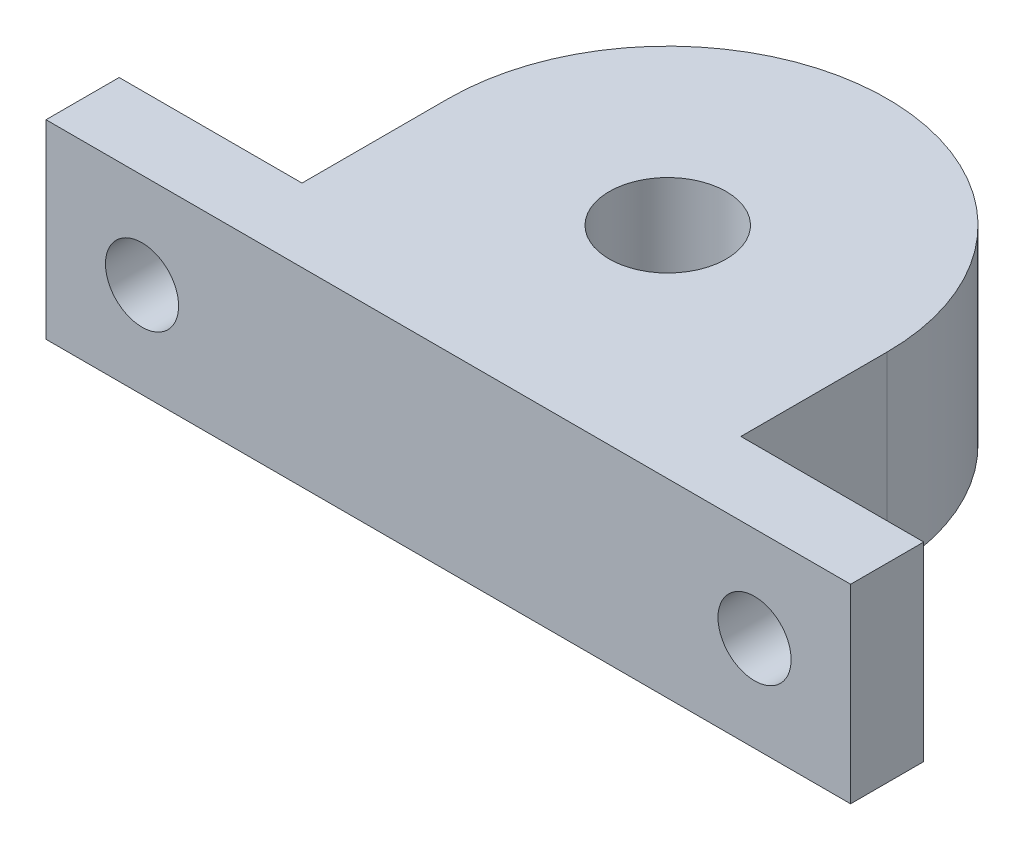
ISO-10303-21;
HEADER;
FILE_DESCRIPTION(('STEP AP214'),'2;1');
FILE_NAME('part.step','',(''),(''),'','','');
FILE_SCHEMA(('AUTOMOTIVE_DESIGN { 1 0 10303 214 1 1 1 1 }'));
ENDSEC;
DATA;
#1=APPLICATION_CONTEXT('core data for automotive mechanical design processes');
#2=APPLICATION_PROTOCOL_DEFINITION('international standard','automotive_design',2000,#1);
#3=PRODUCT_CONTEXT('',#1,'mechanical');
#4=PRODUCT('Part','Part','',(#3));
#5=PRODUCT_RELATED_PRODUCT_CATEGORY('part','',(#4));
#6=PRODUCT_DEFINITION_FORMATION('','',#4);
#7=PRODUCT_DEFINITION_CONTEXT('part definition',#1,'design');
#8=PRODUCT_DEFINITION('design','',#6,#7);
#9=PRODUCT_DEFINITION_SHAPE('','',#8);
#10=(LENGTH_UNIT() NAMED_UNIT(*) SI_UNIT(.MILLI.,.METRE.));
#11=(NAMED_UNIT(*) PLANE_ANGLE_UNIT() SI_UNIT($,.RADIAN.));
#12=(NAMED_UNIT(*) SI_UNIT($,.STERADIAN.) SOLID_ANGLE_UNIT());
#13=UNCERTAINTY_MEASURE_WITH_UNIT(LENGTH_MEASURE(1.E-05),#10,'distance_accuracy_value','');
#14=(GEOMETRIC_REPRESENTATION_CONTEXT(3) GLOBAL_UNCERTAINTY_ASSIGNED_CONTEXT((#13)) GLOBAL_UNIT_ASSIGNED_CONTEXT((#10,
#11,#12)) REPRESENTATION_CONTEXT('',''));
#15=CARTESIAN_POINT('',(0.,0.,0.));
#16=DIRECTION('',(0.,0.,1.));
#17=DIRECTION('',(1.,0.,0.));
#18=AXIS2_PLACEMENT_3D('',#15,#16,#17);
#19=CARTESIAN_POINT('',(0.,13.,0.));
#20=DIRECTION('',(0.,1.,0.));
#21=DIRECTION('',(0.,0.,1.));
#22=AXIS2_PLACEMENT_3D('',#19,#20,#21);
#23=PLANE('',#22);
#24=CARTESIAN_POINT('',(0.,13.,0.));
#25=DIRECTION('',(0.,1.,0.));
#26=DIRECTION('',(0.,0.,1.));
#27=AXIS2_PLACEMENT_3D('',#24,#25,#26);
#28=CIRCLE('',#27,15.);
#29=CARTESIAN_POINT('',(15.,13.,0.));
#30=VERTEX_POINT('',#29);
#31=CARTESIAN_POINT('',(-15.,13.,0.));
#32=VERTEX_POINT('',#31);
#33=EDGE_CURVE('E148',#30,#32,#28,.T.);
#34=ORIENTED_EDGE('',*,*,#33,.T.);
#35=DIRECTION('',(0.,0.,1.));
#36=VECTOR('',#35,1.);
#37=CARTESIAN_POINT('',(-15.,13.,0.));
#38=LINE('',#37,#36);
#39=CARTESIAN_POINT('',(-15.,13.,10.));
#40=VERTEX_POINT('',#39);
#41=EDGE_CURVE('E96',#32,#40,#38,.T.);
#42=ORIENTED_EDGE('',*,*,#41,.T.);
#43=DIRECTION('',(-1.,0.,0.));
#44=VECTOR('',#43,1.);
#45=CARTESIAN_POINT('',(-15.,13.,10.));
#46=LINE('',#45,#44);
#47=CARTESIAN_POINT('',(-27.5,13.,10.));
#48=VERTEX_POINT('',#47);
#49=EDGE_CURVE('E163',#40,#48,#46,.T.);
#50=ORIENTED_EDGE('',*,*,#49,.T.);
#51=DIRECTION('',(0.,0.,1.));
#52=VECTOR('',#51,1.);
#53=CARTESIAN_POINT('',(-27.5,13.,10.));
#54=LINE('',#53,#52);
#55=CARTESIAN_POINT('',(-27.5,13.,15.));
#56=VERTEX_POINT('',#55);
#57=EDGE_CURVE('E176',#48,#56,#54,.T.);
#58=ORIENTED_EDGE('',*,*,#57,.T.);
#59=DIRECTION('',(1.,0.,0.));
#60=VECTOR('',#59,1.);
#61=CARTESIAN_POINT('',(-27.5,13.,15.));
#62=LINE('',#61,#60);
#63=CARTESIAN_POINT('',(27.5,13.,15.));
#64=VERTEX_POINT('',#63);
#65=EDGE_CURVE('E115',#56,#64,#62,.T.);
#66=ORIENTED_EDGE('',*,*,#65,.T.);
#67=DIRECTION('',(0.,0.,-1.));
#68=VECTOR('',#67,1.);
#69=CARTESIAN_POINT('',(27.5,13.,15.));
#70=LINE('',#69,#68);
#71=CARTESIAN_POINT('',(27.5,13.,9.99999999999999));
#72=VERTEX_POINT('',#71);
#73=EDGE_CURVE('E109',#64,#72,#70,.T.);
#74=ORIENTED_EDGE('',*,*,#73,.T.);
#75=DIRECTION('',(-1.,0.,0.));
#76=VECTOR('',#75,1.);
#77=CARTESIAN_POINT('',(27.5,13.,9.99999999999999));
#78=LINE('',#77,#76);
#79=CARTESIAN_POINT('',(15.,13.,9.99999999999999));
#80=VERTEX_POINT('',#79);
#81=EDGE_CURVE('E113',#72,#80,#78,.T.);
#82=ORIENTED_EDGE('',*,*,#81,.T.);
#83=DIRECTION('',(0.,0.,-1.));
#84=VECTOR('',#83,1.);
#85=CARTESIAN_POINT('',(15.,13.,9.99999999999999));
#86=LINE('',#85,#84);
#87=EDGE_CURVE('E53',#80,#30,#86,.T.);
#88=ORIENTED_EDGE('',*,*,#87,.T.);
#89=EDGE_LOOP('',(#34,#42,#50,#58,#66,#74,#82,#88));
#90=FACE_BOUND('',#89,.T.);
#91=CARTESIAN_POINT('',(0.,13.,0.));
#92=DIRECTION('',(0.,1.,0.));
#93=DIRECTION('',(0.,0.,1.));
#94=AXIS2_PLACEMENT_3D('',#91,#92,#93);
#95=CIRCLE('',#94,4.);
#96=CARTESIAN_POINT('',(0.,13.,-4.));
#97=VERTEX_POINT('',#96);
#98=EDGE_CURVE('E137',#97,#97,#95,.T.);
#99=ORIENTED_EDGE('',*,*,#98,.F.);
#100=EDGE_LOOP('',(#99));
#101=FACE_BOUND('',#100,.T.);
#102=ADVANCED_FACE('F36',(#90,#101),#23,.T.);
#103=CARTESIAN_POINT('',(0.,0.,0.));
#104=DIRECTION('',(0.,1.,0.));
#105=DIRECTION('',(0.,0.,1.));
#106=AXIS2_PLACEMENT_3D('',#103,#104,#105);
#107=PLANE('',#106);
#108=CARTESIAN_POINT('',(0.,0.,0.));
#109=DIRECTION('',(0.,1.,0.));
#110=DIRECTION('',(0.,0.,1.));
#111=AXIS2_PLACEMENT_3D('',#108,#109,#110);
#112=CIRCLE('',#111,15.);
#113=CARTESIAN_POINT('',(15.,0.,0.));
#114=VERTEX_POINT('',#113);
#115=CARTESIAN_POINT('',(-15.,0.,0.));
#116=VERTEX_POINT('',#115);
#117=EDGE_CURVE('E133',#114,#116,#112,.T.);
#118=ORIENTED_EDGE('',*,*,#117,.F.);
#119=DIRECTION('',(0.,0.,-1.));
#120=VECTOR('',#119,1.);
#121=CARTESIAN_POINT('',(15.,0.,9.99999999999999));
#122=LINE('',#121,#120);
#123=CARTESIAN_POINT('',(15.,0.,9.99999999999999));
#124=VERTEX_POINT('',#123);
#125=EDGE_CURVE('E88',#124,#114,#122,.T.);
#126=ORIENTED_EDGE('',*,*,#125,.F.);
#127=DIRECTION('',(-1.,0.,0.));
#128=VECTOR('',#127,1.);
#129=CARTESIAN_POINT('',(27.5,0.,9.99999999999999));
#130=LINE('',#129,#128);
#131=CARTESIAN_POINT('',(27.5,0.,9.99999999999999));
#132=VERTEX_POINT('',#131);
#133=EDGE_CURVE('E82',#132,#124,#130,.T.);
#134=ORIENTED_EDGE('',*,*,#133,.F.);
#135=DIRECTION('',(0.,0.,-1.));
#136=VECTOR('',#135,1.);
#137=CARTESIAN_POINT('',(27.5,0.,15.));
#138=LINE('',#137,#136);
#139=CARTESIAN_POINT('',(27.5,0.,15.));
#140=VERTEX_POINT('',#139);
#141=EDGE_CURVE('E123',#140,#132,#138,.T.);
#142=ORIENTED_EDGE('',*,*,#141,.F.);
#143=DIRECTION('',(1.,0.,0.));
#144=VECTOR('',#143,1.);
#145=CARTESIAN_POINT('',(-27.5,0.,15.));
#146=LINE('',#145,#144);
#147=CARTESIAN_POINT('',(-27.5,0.,15.));
#148=VERTEX_POINT('',#147);
#149=EDGE_CURVE('E143',#148,#140,#146,.T.);
#150=ORIENTED_EDGE('',*,*,#149,.F.);
#151=DIRECTION('',(0.,0.,1.));
#152=VECTOR('',#151,1.);
#153=CARTESIAN_POINT('',(-27.5,0.,10.));
#154=LINE('',#153,#152);
#155=CARTESIAN_POINT('',(-27.5,0.,10.));
#156=VERTEX_POINT('',#155);
#157=EDGE_CURVE('E141',#156,#148,#154,.T.);
#158=ORIENTED_EDGE('',*,*,#157,.F.);
#159=DIRECTION('',(-1.,0.,0.));
#160=VECTOR('',#159,1.);
#161=CARTESIAN_POINT('',(-15.,0.,10.));
#162=LINE('',#161,#160);
#163=CARTESIAN_POINT('',(-15.,0.,10.));
#164=VERTEX_POINT('',#163);
#165=EDGE_CURVE('E139',#164,#156,#162,.T.);
#166=ORIENTED_EDGE('',*,*,#165,.F.);
#167=DIRECTION('',(0.,0.,1.));
#168=VECTOR('',#167,1.);
#169=CARTESIAN_POINT('',(-15.,0.,0.));
#170=LINE('',#169,#168);
#171=EDGE_CURVE('E136',#116,#164,#170,.T.);
#172=ORIENTED_EDGE('',*,*,#171,.F.);
#173=EDGE_LOOP('',(#118,#126,#134,#142,#150,#158,#166,#172));
#174=FACE_BOUND('',#173,.T.);
#175=CARTESIAN_POINT('',(0.,0.,0.));
#176=DIRECTION('',(0.,1.,0.));
#177=DIRECTION('',(0.,0.,1.));
#178=AXIS2_PLACEMENT_3D('',#175,#176,#177);
#179=CIRCLE('',#178,4.);
#180=CARTESIAN_POINT('',(0.,0.,-4.));
#181=VERTEX_POINT('',#180);
#182=EDGE_CURVE('E182',#181,#181,#179,.T.);
#183=ORIENTED_EDGE('',*,*,#182,.T.);
#184=EDGE_LOOP('',(#183));
#185=FACE_BOUND('',#184,.T.);
#186=ADVANCED_FACE('F167',(#174,#185),#107,.F.);
#187=CARTESIAN_POINT('',(0.,13.,0.));
#188=DIRECTION('',(0.,-1.,0.));
#189=DIRECTION('',(0.,0.,-1.));
#190=AXIS2_PLACEMENT_3D('',#187,#188,#189);
#191=CYLINDRICAL_SURFACE('',#190,15.);
#192=ORIENTED_EDGE('',*,*,#117,.T.);
#193=DIRECTION('',(0.,-1.,0.));
#194=VECTOR('',#193,1.);
#195=CARTESIAN_POINT('',(-15.,13.,0.));
#196=LINE('',#195,#194);
#197=EDGE_CURVE('E11',#32,#116,#196,.T.);
#198=ORIENTED_EDGE('',*,*,#197,.F.);
#199=ORIENTED_EDGE('',*,*,#33,.F.);
#200=DIRECTION('',(0.,-1.,0.));
#201=VECTOR('',#200,1.);
#202=CARTESIAN_POINT('',(15.,13.,0.));
#203=LINE('',#202,#201);
#204=EDGE_CURVE('E129',#30,#114,#203,.T.);
#205=ORIENTED_EDGE('',*,*,#204,.T.);
#206=EDGE_LOOP('',(#192,#198,#199,#205));
#207=FACE_BOUND('',#206,.T.);
#208=ADVANCED_FACE('F38',(#207),#191,.T.);
#209=CARTESIAN_POINT('',(-15.,13.,0.));
#210=DIRECTION('',(1.,0.,0.));
#211=DIRECTION('',(0.,0.,-1.));
#212=AXIS2_PLACEMENT_3D('',#209,#210,#211);
#213=PLANE('',#212);
#214=ORIENTED_EDGE('',*,*,#171,.T.);
#215=DIRECTION('',(0.,-1.,0.));
#216=VECTOR('',#215,1.);
#217=CARTESIAN_POINT('',(-15.,13.,10.));
#218=LINE('',#217,#216);
#219=EDGE_CURVE('E45',#40,#164,#218,.T.);
#220=ORIENTED_EDGE('',*,*,#219,.F.);
#221=ORIENTED_EDGE('',*,*,#41,.F.);
#222=ORIENTED_EDGE('',*,*,#197,.T.);
#223=EDGE_LOOP('',(#214,#220,#221,#222));
#224=FACE_BOUND('',#223,.T.);
#225=ADVANCED_FACE('F240',(#224),#213,.F.);
#226=CARTESIAN_POINT('',(-15.,13.,10.));
#227=DIRECTION('',(0.,0.,1.));
#228=DIRECTION('',(1.,0.,0.));
#229=AXIS2_PLACEMENT_3D('',#226,#227,#228);
#230=PLANE('',#229);
#231=CARTESIAN_POINT('',(-20.935,6.5,10.));
#232=DIRECTION('',(0.,0.,-1.));
#233=DIRECTION('',(-1.,0.,0.));
#234=AXIS2_PLACEMENT_3D('',#231,#232,#233);
#235=CIRCLE('',#234,2.5);
#236=CARTESIAN_POINT('',(-23.435,6.5,10.));
#237=VERTEX_POINT('',#236);
#238=EDGE_CURVE('E190',#237,#237,#235,.T.);
#239=ORIENTED_EDGE('',*,*,#238,.F.);
#240=EDGE_LOOP('',(#239));
#241=FACE_BOUND('',#240,.T.);
#242=ORIENTED_EDGE('',*,*,#165,.T.);
#243=DIRECTION('',(0.,-1.,0.));
#244=VECTOR('',#243,1.);
#245=CARTESIAN_POINT('',(-27.5,13.,10.));
#246=LINE('',#245,#244);
#247=EDGE_CURVE('E155',#48,#156,#246,.T.);
#248=ORIENTED_EDGE('',*,*,#247,.F.);
#249=ORIENTED_EDGE('',*,*,#49,.F.);
#250=ORIENTED_EDGE('',*,*,#219,.T.);
#251=EDGE_LOOP('',(#242,#248,#249,#250));
#252=FACE_BOUND('',#251,.T.);
#253=ADVANCED_FACE('F161',(#241,#252),#230,.F.);
#254=CARTESIAN_POINT('',(-27.5,13.,10.));
#255=DIRECTION('',(1.,0.,0.));
#256=DIRECTION('',(0.,0.,-1.));
#257=AXIS2_PLACEMENT_3D('',#254,#255,#256);
#258=PLANE('',#257);
#259=ORIENTED_EDGE('',*,*,#157,.T.);
#260=DIRECTION('',(0.,-1.,0.));
#261=VECTOR('',#260,1.);
#262=CARTESIAN_POINT('',(-27.5,13.,15.));
#263=LINE('',#262,#261);
#264=EDGE_CURVE('E152',#56,#148,#263,.T.);
#265=ORIENTED_EDGE('',*,*,#264,.F.);
#266=ORIENTED_EDGE('',*,*,#57,.F.);
#267=ORIENTED_EDGE('',*,*,#247,.T.);
#268=EDGE_LOOP('',(#259,#265,#266,#267));
#269=FACE_BOUND('',#268,.T.);
#270=ADVANCED_FACE('F172',(#269),#258,.F.);
#271=CARTESIAN_POINT('',(-27.5,13.,15.));
#272=DIRECTION('',(0.,0.,-1.));
#273=DIRECTION('',(-1.,0.,0.));
#274=AXIS2_PLACEMENT_3D('',#271,#272,#273);
#275=PLANE('',#274);
#276=CARTESIAN_POINT('',(20.935,6.5,15.));
#277=DIRECTION('',(0.,0.,-1.));
#278=DIRECTION('',(-1.,0.,0.));
#279=AXIS2_PLACEMENT_3D('',#276,#277,#278);
#280=CIRCLE('',#279,2.5);
#281=CARTESIAN_POINT('',(18.435,6.5,15.));
#282=VERTEX_POINT('',#281);
#283=EDGE_CURVE('E193',#282,#282,#280,.T.);
#284=ORIENTED_EDGE('',*,*,#283,.T.);
#285=EDGE_LOOP('',(#284));
#286=FACE_BOUND('',#285,.T.);
#287=CARTESIAN_POINT('',(-20.935,6.5,15.));
#288=DIRECTION('',(0.,0.,-1.));
#289=DIRECTION('',(-1.,0.,0.));
#290=AXIS2_PLACEMENT_3D('',#287,#288,#289);
#291=CIRCLE('',#290,2.5);
#292=CARTESIAN_POINT('',(-23.435,6.5,15.));
#293=VERTEX_POINT('',#292);
#294=EDGE_CURVE('E185',#293,#293,#291,.T.);
#295=ORIENTED_EDGE('',*,*,#294,.T.);
#296=EDGE_LOOP('',(#295));
#297=FACE_BOUND('',#296,.T.);
#298=ORIENTED_EDGE('',*,*,#149,.T.);
#299=DIRECTION('',(0.,-1.,0.));
#300=VECTOR('',#299,1.);
#301=CARTESIAN_POINT('',(27.5,13.,15.));
#302=LINE('',#301,#300);
#303=EDGE_CURVE('E124',#64,#140,#302,.T.);
#304=ORIENTED_EDGE('',*,*,#303,.F.);
#305=ORIENTED_EDGE('',*,*,#65,.F.);
#306=ORIENTED_EDGE('',*,*,#264,.T.);
#307=EDGE_LOOP('',(#298,#304,#305,#306));
#308=FACE_BOUND('',#307,.T.);
#309=ADVANCED_FACE('F175',(#286,#297,#308),#275,.F.);
#310=CARTESIAN_POINT('',(27.5,13.,15.));
#311=DIRECTION('',(-1.,0.,0.));
#312=DIRECTION('',(0.,0.,1.));
#313=AXIS2_PLACEMENT_3D('',#310,#311,#312);
#314=PLANE('',#313);
#315=ORIENTED_EDGE('',*,*,#141,.T.);
#316=DIRECTION('',(0.,-1.,0.));
#317=VECTOR('',#316,1.);
#318=CARTESIAN_POINT('',(27.5,13.,9.99999999999999));
#319=LINE('',#318,#317);
#320=EDGE_CURVE('E120',#72,#132,#319,.T.);
#321=ORIENTED_EDGE('',*,*,#320,.F.);
#322=ORIENTED_EDGE('',*,*,#73,.F.);
#323=ORIENTED_EDGE('',*,*,#303,.T.);
#324=EDGE_LOOP('',(#315,#321,#322,#323));
#325=FACE_BOUND('',#324,.T.);
#326=ADVANCED_FACE('F121',(#325),#314,.F.);
#327=CARTESIAN_POINT('',(27.5,13.,9.99999999999999));
#328=DIRECTION('',(0.,0.,1.));
#329=DIRECTION('',(1.,0.,0.));
#330=AXIS2_PLACEMENT_3D('',#327,#328,#329);
#331=PLANE('',#330);
#332=CARTESIAN_POINT('',(20.935,6.5,9.99999999999999));
#333=DIRECTION('',(0.,0.,-1.));
#334=DIRECTION('',(-1.,0.,0.));
#335=AXIS2_PLACEMENT_3D('',#332,#333,#334);
#336=CIRCLE('',#335,2.5);
#337=CARTESIAN_POINT('',(18.435,6.5,9.99999999999999));
#338=VERTEX_POINT('',#337);
#339=EDGE_CURVE('E196',#338,#338,#336,.T.);
#340=ORIENTED_EDGE('',*,*,#339,.F.);
#341=EDGE_LOOP('',(#340));
#342=FACE_BOUND('',#341,.T.);
#343=ORIENTED_EDGE('',*,*,#133,.T.);
#344=DIRECTION('',(0.,-1.,0.));
#345=VECTOR('',#344,1.);
#346=CARTESIAN_POINT('',(15.,13.,9.99999999999999));
#347=LINE('',#346,#345);
#348=EDGE_CURVE('E125',#80,#124,#347,.T.);
#349=ORIENTED_EDGE('',*,*,#348,.F.);
#350=ORIENTED_EDGE('',*,*,#81,.F.);
#351=ORIENTED_EDGE('',*,*,#320,.T.);
#352=EDGE_LOOP('',(#343,#349,#350,#351));
#353=FACE_BOUND('',#352,.T.);
#354=ADVANCED_FACE('F127',(#342,#353),#331,.F.);
#355=CARTESIAN_POINT('',(15.,13.,9.99999999999999));
#356=DIRECTION('',(-1.,0.,0.));
#357=DIRECTION('',(0.,0.,1.));
#358=AXIS2_PLACEMENT_3D('',#355,#356,#357);
#359=PLANE('',#358);
#360=ORIENTED_EDGE('',*,*,#125,.T.);
#361=ORIENTED_EDGE('',*,*,#204,.F.);
#362=ORIENTED_EDGE('',*,*,#87,.F.);
#363=ORIENTED_EDGE('',*,*,#348,.T.);
#364=EDGE_LOOP('',(#360,#361,#362,#363));
#365=FACE_BOUND('',#364,.T.);
#366=ADVANCED_FACE('F203',(#365),#359,.F.);
#367=CARTESIAN_POINT('',(0.,13.,0.));
#368=DIRECTION('',(0.,-1.,0.));
#369=DIRECTION('',(0.,0.,-1.));
#370=AXIS2_PLACEMENT_3D('',#367,#368,#369);
#371=CYLINDRICAL_SURFACE('',#370,4.);
#372=CARTESIAN_POINT('',(0.,13.,-4.));
#373=CARTESIAN_POINT('',(0.,12.8645833333333,-4.));
#374=CARTESIAN_POINT('',(0.,12.7291666666667,-4.));
#375=CARTESIAN_POINT('',(0.,12.4583333333333,-4.));
#376=CARTESIAN_POINT('',(0.,12.3229166666667,-4.));
#377=CARTESIAN_POINT('',(0.,12.0520833333333,-4.));
#378=CARTESIAN_POINT('',(0.,11.9166666666667,-4.));
#379=CARTESIAN_POINT('',(0.,11.6458333333333,-4.));
#380=CARTESIAN_POINT('',(0.,11.5104166666667,-4.));
#381=CARTESIAN_POINT('',(0.,11.2395833333333,-4.));
#382=CARTESIAN_POINT('',(0.,11.1041666666667,-4.));
#383=CARTESIAN_POINT('',(0.,10.8333333333333,-4.));
#384=CARTESIAN_POINT('',(0.,10.6979166666667,-4.));
#385=CARTESIAN_POINT('',(0.,10.4270833333333,-4.));
#386=CARTESIAN_POINT('',(0.,10.2916666666667,-4.));
#387=CARTESIAN_POINT('',(0.,10.0208333333333,-4.));
#388=CARTESIAN_POINT('',(0.,9.88541666666667,-4.));
#389=CARTESIAN_POINT('',(0.,9.61458333333333,-4.));
#390=CARTESIAN_POINT('',(0.,9.47916666666667,-4.));
#391=CARTESIAN_POINT('',(0.,9.20833333333333,-4.));
#392=CARTESIAN_POINT('',(0.,9.07291666666667,-4.));
#393=CARTESIAN_POINT('',(0.,8.80208333333333,-4.));
#394=CARTESIAN_POINT('',(0.,8.66666666666667,-4.));
#395=CARTESIAN_POINT('',(0.,8.39583333333333,-4.));
#396=CARTESIAN_POINT('',(0.,8.26041666666667,-4.));
#397=CARTESIAN_POINT('',(0.,7.98958333333333,-4.));
#398=CARTESIAN_POINT('',(0.,7.85416666666667,-4.));
#399=CARTESIAN_POINT('',(0.,7.58333333333333,-4.));
#400=CARTESIAN_POINT('',(0.,7.44791666666667,-4.));
#401=CARTESIAN_POINT('',(0.,7.17708333333333,-4.));
#402=CARTESIAN_POINT('',(0.,7.04166666666667,-4.));
#403=CARTESIAN_POINT('',(0.,6.77083333333333,-4.));
#404=CARTESIAN_POINT('',(0.,6.63541666666667,-4.));
#405=CARTESIAN_POINT('',(0.,6.36458333333333,-4.));
#406=CARTESIAN_POINT('',(0.,6.22916666666667,-4.));
#407=CARTESIAN_POINT('',(0.,5.95833333333333,-4.));
#408=CARTESIAN_POINT('',(0.,5.82291666666667,-4.));
#409=CARTESIAN_POINT('',(0.,5.55208333333333,-4.));
#410=CARTESIAN_POINT('',(0.,5.41666666666667,-4.));
#411=CARTESIAN_POINT('',(0.,5.14583333333333,-4.));
#412=CARTESIAN_POINT('',(0.,5.01041666666667,-4.));
#413=CARTESIAN_POINT('',(0.,4.73958333333333,-4.));
#414=CARTESIAN_POINT('',(0.,4.60416666666667,-4.));
#415=CARTESIAN_POINT('',(0.,4.33333333333333,-4.));
#416=CARTESIAN_POINT('',(0.,4.19791666666667,-4.));
#417=CARTESIAN_POINT('',(0.,3.92708333333333,-4.));
#418=CARTESIAN_POINT('',(0.,3.79166666666667,-4.));
#419=CARTESIAN_POINT('',(0.,3.52083333333333,-4.));
#420=CARTESIAN_POINT('',(0.,3.38541666666667,-4.));
#421=CARTESIAN_POINT('',(0.,3.11458333333333,-4.));
#422=CARTESIAN_POINT('',(0.,2.97916666666667,-4.));
#423=CARTESIAN_POINT('',(0.,2.70833333333333,-4.));
#424=CARTESIAN_POINT('',(0.,2.57291666666667,-4.));
#425=CARTESIAN_POINT('',(0.,2.30208333333333,-4.));
#426=CARTESIAN_POINT('',(0.,2.16666666666667,-4.));
#427=CARTESIAN_POINT('',(0.,1.89583333333333,-4.));
#428=CARTESIAN_POINT('',(0.,1.76041666666667,-4.));
#429=CARTESIAN_POINT('',(0.,1.48958333333333,-4.));
#430=CARTESIAN_POINT('',(0.,1.35416666666667,-4.));
#431=CARTESIAN_POINT('',(0.,1.08333333333333,-4.));
#432=CARTESIAN_POINT('',(0.,0.947916666666667,-4.));
#433=CARTESIAN_POINT('',(0.,0.677083333333334,-4.));
#434=CARTESIAN_POINT('',(0.,0.541666666666667,-4.));
#435=CARTESIAN_POINT('',(0.,0.270833333333334,-4.));
#436=CARTESIAN_POINT('',(0.,0.135416666666667,-4.));
#437=CARTESIAN_POINT('',(0.,0.,-4.));
#438=B_SPLINE_CURVE_WITH_KNOTS('',3,(#372,#373,#374,#375,#376,#377,#378,#379,#380,#381,#382,
#383,#384,#385,#386,#387,#388,#389,#390,#391,#392,#393,#394,#395,#396,#397,#398,#399,#400,#401,
#402,#403,#404,#405,#406,#407,#408,#409,#410,#411,#412,#413,#414,#415,#416,#417,#418,#419,#420,
#421,#422,#423,#424,#425,#426,#427,#428,#429,#430,#431,#432,#433,#434,#435,#436,#437),
.UNSPECIFIED.,.F.,.F.,(4,2,2,2,2,2,2,2,2,2,2,2,2,2,2,2,2,2,2,2,2,2,2,2,2,2,2,2,2,2,2,2,4),(0.,
0.406249999999999,0.812499999999999,1.21875,1.625,2.03125,2.4375,2.84375,3.25,3.65625,4.0625,
4.46875,4.875,5.28125,5.6875,6.09375,6.5,6.90625,7.3125,7.71875,8.125,8.53125,8.9375,9.34375,
9.75,10.15625,10.5625,10.96875,11.375,11.78125,12.1875,12.59375,13.),.UNSPECIFIED.);
#439=EDGE_CURVE('BSEAM209',#97,#181,#438,.T.);
#440=ORIENTED_EDGE('',*,*,#98,.T.);
#441=ORIENTED_EDGE('',*,*,#182,.F.);
#442=ORIENTED_EDGE('',*,*,#439,.T.);
#443=ORIENTED_EDGE('',*,*,#439,.F.);
#444=EDGE_LOOP('',(#440,#442,#441,#443));
#445=FACE_BOUND('',#444,.T.);
#446=ADVANCED_FACE('F209',(#445),#371,.F.);
#447=CARTESIAN_POINT('',(-20.935,6.5,10.));
#448=DIRECTION('',(0.,0.,-1.));
#449=DIRECTION('',(-1.,0.,0.));
#450=AXIS2_PLACEMENT_3D('',#447,#448,#449);
#451=CYLINDRICAL_SURFACE('',#450,2.5);
#452=ORIENTED_EDGE('',*,*,#294,.F.);
#453=EDGE_LOOP('',(#452));
#454=FACE_BOUND('',#453,.T.);
#455=ORIENTED_EDGE('',*,*,#238,.T.);
#456=EDGE_LOOP('',(#455));
#457=FACE_BOUND('',#456,.T.);
#458=ADVANCED_FACE('F221',(#454,#457),#451,.F.);
#459=CARTESIAN_POINT('',(20.935,6.5,9.99999999999999));
#460=DIRECTION('',(0.,0.,-1.));
#461=DIRECTION('',(-1.,0.,0.));
#462=AXIS2_PLACEMENT_3D('',#459,#460,#461);
#463=CYLINDRICAL_SURFACE('',#462,2.5);
#464=ORIENTED_EDGE('',*,*,#283,.F.);
#465=EDGE_LOOP('',(#464));
#466=FACE_BOUND('',#465,.T.);
#467=ORIENTED_EDGE('',*,*,#339,.T.);
#468=EDGE_LOOP('',(#467));
#469=FACE_BOUND('',#468,.T.);
#470=ADVANCED_FACE('F200',(#466,#469),#463,.F.);
#471=CLOSED_SHELL('',(#102,#186,#208,#225,#253,#270,#309,#326,#354,#366,#446,#458,#470));
#472=MANIFOLD_SOLID_BREP('B2',#471);
#473=ADVANCED_BREP_SHAPE_REPRESENTATION('',(#18,#472),#14);
#474=SHAPE_DEFINITION_REPRESENTATION(#9,#473);
ENDSEC;
END-ISO-10303-21;
